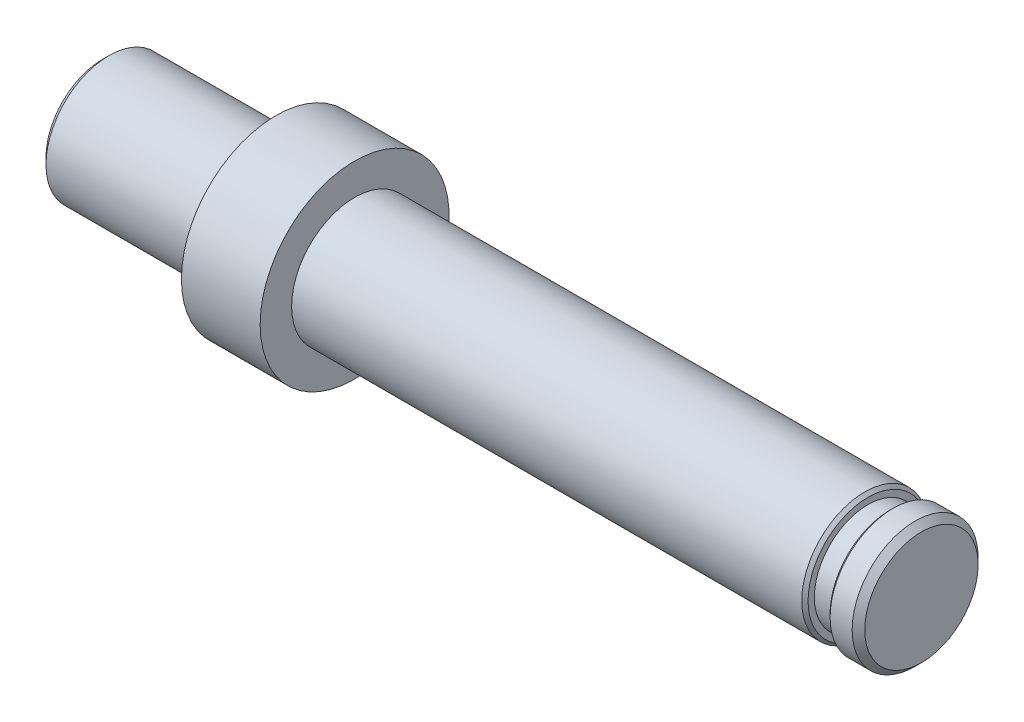
ISO-10303-21;
HEADER;
FILE_DESCRIPTION(('STEP AP214'),'2;1');
FILE_NAME('part.step','',(''),(''),'','','');
FILE_SCHEMA(('AUTOMOTIVE_DESIGN { 1 0 10303 214 1 1 1 1 }'));
ENDSEC;
DATA;
#1=APPLICATION_CONTEXT('core data for automotive mechanical design processes');
#2=APPLICATION_PROTOCOL_DEFINITION('international standard','automotive_design',2000,#1);
#3=PRODUCT_CONTEXT('',#1,'mechanical');
#4=PRODUCT('Part','Part','',(#3));
#5=PRODUCT_RELATED_PRODUCT_CATEGORY('part','',(#4));
#6=PRODUCT_DEFINITION_FORMATION('','',#4);
#7=PRODUCT_DEFINITION_CONTEXT('part definition',#1,'design');
#8=PRODUCT_DEFINITION('design','',#6,#7);
#9=PRODUCT_DEFINITION_SHAPE('','',#8);
#10=(LENGTH_UNIT() NAMED_UNIT(*) SI_UNIT(.MILLI.,.METRE.));
#11=(NAMED_UNIT(*) PLANE_ANGLE_UNIT() SI_UNIT($,.RADIAN.));
#12=(NAMED_UNIT(*) SI_UNIT($,.STERADIAN.) SOLID_ANGLE_UNIT());
#13=UNCERTAINTY_MEASURE_WITH_UNIT(LENGTH_MEASURE(1.E-05),#10,'distance_accuracy_value','');
#14=(GEOMETRIC_REPRESENTATION_CONTEXT(3) GLOBAL_UNCERTAINTY_ASSIGNED_CONTEXT((#13)) GLOBAL_UNIT_ASSIGNED_CONTEXT((#10,
#11,#12)) REPRESENTATION_CONTEXT('',''));
#15=CARTESIAN_POINT('',(0.,0.,0.));
#16=DIRECTION('',(0.,0.,1.));
#17=DIRECTION('',(1.,0.,0.));
#18=AXIS2_PLACEMENT_3D('',#15,#16,#17);
#19=CARTESIAN_POINT('',(0.,2.,0.));
#20=DIRECTION('',(1.,0.,0.));
#21=DIRECTION('',(0.,0.,-1.));
#22=AXIS2_PLACEMENT_3D('',#19,#20,#21);
#23=PLANE('',#22);
#24=CARTESIAN_POINT('',(0.,0.,0.));
#25=DIRECTION('',(1.,0.,0.));
#26=DIRECTION('',(0.,0.,-1.));
#27=AXIS2_PLACEMENT_3D('',#24,#25,#26);
#28=CIRCLE('',#27,1.8);
#29=CARTESIAN_POINT('',(0.,0.,-1.8));
#30=VERTEX_POINT('',#29);
#31=EDGE_CURVE('E76',#30,#30,#28,.F.);
#32=ORIENTED_EDGE('',*,*,#31,.T.);
#33=EDGE_LOOP('',(#32));
#34=FACE_BOUND('',#33,.T.);
#35=ADVANCED_FACE('F39',(#34),#23,.F.);
#36=CARTESIAN_POINT('',(26.,0.,0.));
#37=DIRECTION('',(-1.,0.,0.));
#38=DIRECTION('',(0.,0.,1.));
#39=AXIS2_PLACEMENT_3D('',#36,#37,#38);
#40=PLANE('',#39);
#41=CARTESIAN_POINT('',(26.,0.,0.));
#42=DIRECTION('',(-1.,0.,0.));
#43=DIRECTION('',(0.,0.,1.));
#44=AXIS2_PLACEMENT_3D('',#41,#42,#43);
#45=CIRCLE('',#44,1.8);
#46=CARTESIAN_POINT('',(26.,0.,1.8));
#47=VERTEX_POINT('',#46);
#48=EDGE_CURVE('E64',#47,#47,#45,.F.);
#49=ORIENTED_EDGE('',*,*,#48,.T.);
#50=EDGE_LOOP('',(#49));
#51=FACE_BOUND('',#50,.T.);
#52=ADVANCED_FACE('F135',(#51),#40,.F.);
#53=CARTESIAN_POINT('',(0.,0.,0.));
#54=DIRECTION('',(-1.,0.,0.));
#55=DIRECTION('',(0.,0.,1.));
#56=AXIS2_PLACEMENT_3D('',#53,#54,#55);
#57=CYLINDRICAL_SURFACE('',#56,2.);
#58=CARTESIAN_POINT('',(25.1,0.,0.));
#59=DIRECTION('',(1.,0.,0.));
#60=DIRECTION('',(0.,0.,-1.));
#61=AXIS2_PLACEMENT_3D('',#58,#59,#60);
#62=CIRCLE('',#61,2.);
#63=CARTESIAN_POINT('',(25.1,0.,-2.));
#64=VERTEX_POINT('',#63);
#65=EDGE_CURVE('E53',#64,#64,#62,.T.);
#66=ORIENTED_EDGE('',*,*,#65,.T.);
#67=EDGE_LOOP('',(#66));
#68=FACE_BOUND('',#67,.T.);
#69=CARTESIAN_POINT('',(25.8,0.,0.));
#70=DIRECTION('',(-1.,0.,0.));
#71=DIRECTION('',(0.,0.,1.));
#72=AXIS2_PLACEMENT_3D('',#69,#70,#71);
#73=CIRCLE('',#72,2.);
#74=CARTESIAN_POINT('',(25.8,0.,2.));
#75=VERTEX_POINT('',#74);
#76=EDGE_CURVE('E68',#75,#75,#73,.T.);
#77=ORIENTED_EDGE('',*,*,#76,.T.);
#78=EDGE_LOOP('',(#77));
#79=FACE_BOUND('',#78,.T.);
#80=ADVANCED_FACE('F141',(#68,#79),#57,.T.);
#81=CARTESIAN_POINT('',(25.,2.,0.));
#82=DIRECTION('',(1.,0.,0.));
#83=DIRECTION('',(0.,0.,-1.));
#84=AXIS2_PLACEMENT_3D('',#81,#82,#83);
#85=PLANE('',#84);
#86=CARTESIAN_POINT('',(25.,0.,0.));
#87=DIRECTION('',(1.,0.,0.));
#88=DIRECTION('',(0.,0.,-1.));
#89=AXIS2_PLACEMENT_3D('',#86,#87,#88);
#90=CIRCLE('',#89,1.9);
#91=CARTESIAN_POINT('',(25.,0.,-1.9));
#92=VERTEX_POINT('',#91);
#93=EDGE_CURVE('E58',#92,#92,#90,.F.);
#94=ORIENTED_EDGE('',*,*,#93,.T.);
#95=EDGE_LOOP('',(#94));
#96=FACE_BOUND('',#95,.T.);
#97=CARTESIAN_POINT('',(25.,0.,0.));
#98=DIRECTION('',(-1.,0.,0.));
#99=DIRECTION('',(0.,0.,1.));
#100=AXIS2_PLACEMENT_3D('',#97,#98,#99);
#101=CIRCLE('',#100,1.7);
#102=CARTESIAN_POINT('',(25.,0.,1.7));
#103=VERTEX_POINT('',#102);
#104=EDGE_CURVE('E80',#103,#103,#101,.T.);
#105=ORIENTED_EDGE('',*,*,#104,.F.);
#106=EDGE_LOOP('',(#105));
#107=FACE_BOUND('',#106,.T.);
#108=ADVANCED_FACE('F173',(#96,#107),#85,.F.);
#109=CARTESIAN_POINT('',(0.,0.,0.));
#110=DIRECTION('',(-1.,0.,0.));
#111=DIRECTION('',(0.,0.,1.));
#112=AXIS2_PLACEMENT_3D('',#109,#110,#111);
#113=CYLINDRICAL_SURFACE('',#112,1.7);
#114=CARTESIAN_POINT('',(24.3,0.,0.));
#115=DIRECTION('',(-1.,0.,0.));
#116=DIRECTION('',(0.,0.,1.));
#117=AXIS2_PLACEMENT_3D('',#114,#115,#116);
#118=CIRCLE('',#117,1.7);
#119=CARTESIAN_POINT('',(24.3,0.,1.7));
#120=VERTEX_POINT('',#119);
#121=EDGE_CURVE('E84',#120,#120,#118,.T.);
#122=ORIENTED_EDGE('',*,*,#121,.F.);
#123=EDGE_LOOP('',(#122));
#124=FACE_BOUND('',#123,.T.);
#125=ORIENTED_EDGE('',*,*,#104,.T.);
#126=EDGE_LOOP('',(#125));
#127=FACE_BOUND('',#126,.T.);
#128=ADVANCED_FACE('F132',(#124,#127),#113,.T.);
#129=CARTESIAN_POINT('',(24.3,1.7,0.));
#130=DIRECTION('',(-1.,0.,0.));
#131=DIRECTION('',(0.,0.,1.));
#132=AXIS2_PLACEMENT_3D('',#129,#130,#131);
#133=PLANE('',#132);
#134=CARTESIAN_POINT('',(24.3,0.,0.));
#135=DIRECTION('',(-1.,0.,0.));
#136=DIRECTION('',(0.,0.,1.));
#137=AXIS2_PLACEMENT_3D('',#134,#135,#136);
#138=CIRCLE('',#137,1.9);
#139=CARTESIAN_POINT('',(24.3,0.,1.9));
#140=VERTEX_POINT('',#139);
#141=EDGE_CURVE('E10',#140,#140,#138,.F.);
#142=ORIENTED_EDGE('',*,*,#141,.T.);
#143=EDGE_LOOP('',(#142));
#144=FACE_BOUND('',#143,.T.);
#145=ORIENTED_EDGE('',*,*,#121,.T.);
#146=EDGE_LOOP('',(#145));
#147=FACE_BOUND('',#146,.T.);
#148=ADVANCED_FACE('F127',(#144,#147),#133,.F.);
#149=CARTESIAN_POINT('',(0.,0.,0.));
#150=DIRECTION('',(-1.,0.,0.));
#151=DIRECTION('',(0.,0.,1.));
#152=AXIS2_PLACEMENT_3D('',#149,#150,#151);
#153=CYLINDRICAL_SURFACE('',#152,2.);
#154=CARTESIAN_POINT('',(24.2,0.,0.));
#155=DIRECTION('',(-1.,0.,0.));
#156=DIRECTION('',(0.,0.,1.));
#157=AXIS2_PLACEMENT_3D('',#154,#155,#156);
#158=CIRCLE('',#157,2.);
#159=CARTESIAN_POINT('',(24.2,0.,2.));
#160=VERTEX_POINT('',#159);
#161=EDGE_CURVE('E48',#160,#160,#158,.T.);
#162=ORIENTED_EDGE('',*,*,#161,.T.);
#163=EDGE_LOOP('',(#162));
#164=FACE_BOUND('',#163,.T.);
#165=CARTESIAN_POINT('',(8.,0.,0.));
#166=DIRECTION('',(-1.,0.,0.));
#167=DIRECTION('',(0.,0.,1.));
#168=AXIS2_PLACEMENT_3D('',#165,#166,#167);
#169=CIRCLE('',#168,2.);
#170=CARTESIAN_POINT('',(8.,0.,2.));
#171=VERTEX_POINT('',#170);
#172=EDGE_CURVE('E88',#171,#171,#169,.T.);
#173=ORIENTED_EDGE('',*,*,#172,.F.);
#174=EDGE_LOOP('',(#173));
#175=FACE_BOUND('',#174,.T.);
#176=ADVANCED_FACE('F122',(#164,#175),#153,.T.);
#177=CARTESIAN_POINT('',(8.,2.,0.));
#178=DIRECTION('',(-1.,0.,0.));
#179=DIRECTION('',(0.,0.,1.));
#180=AXIS2_PLACEMENT_3D('',#177,#178,#179);
#181=PLANE('',#180);
#182=CARTESIAN_POINT('',(8.,0.,0.));
#183=DIRECTION('',(-1.,0.,0.));
#184=DIRECTION('',(0.,0.,1.));
#185=AXIS2_PLACEMENT_3D('',#182,#183,#184);
#186=CIRCLE('',#185,3.);
#187=CARTESIAN_POINT('',(8.,0.,3.));
#188=VERTEX_POINT('',#187);
#189=EDGE_CURVE('E92',#188,#188,#186,.T.);
#190=ORIENTED_EDGE('',*,*,#189,.F.);
#191=EDGE_LOOP('',(#190));
#192=FACE_BOUND('',#191,.T.);
#193=ORIENTED_EDGE('',*,*,#172,.T.);
#194=EDGE_LOOP('',(#193));
#195=FACE_BOUND('',#194,.T.);
#196=ADVANCED_FACE('F116',(#192,#195),#181,.F.);
#197=CARTESIAN_POINT('',(0.,0.,0.));
#198=DIRECTION('',(-1.,0.,0.));
#199=DIRECTION('',(0.,0.,1.));
#200=AXIS2_PLACEMENT_3D('',#197,#198,#199);
#201=CYLINDRICAL_SURFACE('',#200,3.);
#202=CARTESIAN_POINT('',(5.5,0.,0.));
#203=DIRECTION('',(-1.,0.,0.));
#204=DIRECTION('',(0.,0.,1.));
#205=AXIS2_PLACEMENT_3D('',#202,#203,#204);
#206=CIRCLE('',#205,3.);
#207=CARTESIAN_POINT('',(5.5,0.,3.));
#208=VERTEX_POINT('',#207);
#209=EDGE_CURVE('E96',#208,#208,#206,.T.);
#210=ORIENTED_EDGE('',*,*,#209,.F.);
#211=EDGE_LOOP('',(#210));
#212=FACE_BOUND('',#211,.T.);
#213=ORIENTED_EDGE('',*,*,#189,.T.);
#214=EDGE_LOOP('',(#213));
#215=FACE_BOUND('',#214,.T.);
#216=ADVANCED_FACE('F110',(#212,#215),#201,.T.);
#217=CARTESIAN_POINT('',(5.5,3.,0.));
#218=DIRECTION('',(1.,0.,0.));
#219=DIRECTION('',(0.,0.,-1.));
#220=AXIS2_PLACEMENT_3D('',#217,#218,#219);
#221=PLANE('',#220);
#222=CARTESIAN_POINT('',(5.5,0.,0.));
#223=DIRECTION('',(-1.,0.,0.));
#224=DIRECTION('',(0.,0.,1.));
#225=AXIS2_PLACEMENT_3D('',#222,#223,#224);
#226=CIRCLE('',#225,2.);
#227=CARTESIAN_POINT('',(5.5,0.,2.));
#228=VERTEX_POINT('',#227);
#229=EDGE_CURVE('E100',#228,#228,#226,.T.);
#230=ORIENTED_EDGE('',*,*,#229,.F.);
#231=EDGE_LOOP('',(#230));
#232=FACE_BOUND('',#231,.T.);
#233=ORIENTED_EDGE('',*,*,#209,.T.);
#234=EDGE_LOOP('',(#233));
#235=FACE_BOUND('',#234,.T.);
#236=ADVANCED_FACE('F107',(#232,#235),#221,.F.);
#237=CARTESIAN_POINT('',(0.,0.,0.));
#238=DIRECTION('',(-1.,0.,0.));
#239=DIRECTION('',(0.,0.,1.));
#240=AXIS2_PLACEMENT_3D('',#237,#238,#239);
#241=CYLINDRICAL_SURFACE('',#240,2.);
#242=CARTESIAN_POINT('',(0.200000000000001,0.,0.));
#243=DIRECTION('',(1.,0.,0.));
#244=DIRECTION('',(0.,0.,-1.));
#245=AXIS2_PLACEMENT_3D('',#242,#243,#244);
#246=CIRCLE('',#245,2.);
#247=CARTESIAN_POINT('',(0.200000000000001,0.,-2.));
#248=VERTEX_POINT('',#247);
#249=EDGE_CURVE('E72',#248,#248,#246,.T.);
#250=ORIENTED_EDGE('',*,*,#249,.T.);
#251=EDGE_LOOP('',(#250));
#252=FACE_BOUND('',#251,.T.);
#253=ORIENTED_EDGE('',*,*,#229,.T.);
#254=EDGE_LOOP('',(#253));
#255=FACE_BOUND('',#254,.T.);
#256=ADVANCED_FACE('F105',(#252,#255),#241,.T.);
#257=CARTESIAN_POINT('',(0.,0.,0.));
#258=DIRECTION('',(1.,0.,0.));
#259=DIRECTION('',(0.,0.,-1.));
#260=AXIS2_PLACEMENT_3D('',#257,#258,#259);
#261=CONICAL_SURFACE('',#260,1.8,0.785398163397448);
#262=ORIENTED_EDGE('',*,*,#249,.F.);
#263=EDGE_LOOP('',(#262));
#264=FACE_BOUND('',#263,.T.);
#265=ORIENTED_EDGE('',*,*,#31,.F.);
#266=EDGE_LOOP('',(#265));
#267=FACE_BOUND('',#266,.T.);
#268=ADVANCED_FACE('F147',(#264,#267),#261,.T.);
#269=CARTESIAN_POINT('',(25.8,0.,0.));
#270=DIRECTION('',(-1.,0.,0.));
#271=DIRECTION('',(0.,0.,1.));
#272=AXIS2_PLACEMENT_3D('',#269,#270,#271);
#273=CONICAL_SURFACE('',#272,2.,0.785398163397444);
#274=ORIENTED_EDGE('',*,*,#48,.F.);
#275=EDGE_LOOP('',(#274));
#276=FACE_BOUND('',#275,.T.);
#277=ORIENTED_EDGE('',*,*,#76,.F.);
#278=EDGE_LOOP('',(#277));
#279=FACE_BOUND('',#278,.T.);
#280=ADVANCED_FACE('F153',(#276,#279),#273,.T.);
#281=CARTESIAN_POINT('',(25.,0.,0.));
#282=DIRECTION('',(1.,0.,0.));
#283=DIRECTION('',(0.,0.,-1.));
#284=AXIS2_PLACEMENT_3D('',#281,#282,#283);
#285=CONICAL_SURFACE('',#284,1.9,0.78539816339744);
#286=ORIENTED_EDGE('',*,*,#65,.F.);
#287=EDGE_LOOP('',(#286));
#288=FACE_BOUND('',#287,.T.);
#289=ORIENTED_EDGE('',*,*,#93,.F.);
#290=EDGE_LOOP('',(#289));
#291=FACE_BOUND('',#290,.T.);
#292=ADVANCED_FACE('F159',(#288,#291),#285,.T.);
#293=CARTESIAN_POINT('',(24.2,0.,0.));
#294=DIRECTION('',(-1.,0.,0.));
#295=DIRECTION('',(0.,0.,1.));
#296=AXIS2_PLACEMENT_3D('',#293,#294,#295);
#297=CONICAL_SURFACE('',#296,2.,0.785398163397461);
#298=ORIENTED_EDGE('',*,*,#141,.F.);
#299=EDGE_LOOP('',(#298));
#300=FACE_BOUND('',#299,.T.);
#301=ORIENTED_EDGE('',*,*,#161,.F.);
#302=EDGE_LOOP('',(#301));
#303=FACE_BOUND('',#302,.T.);
#304=ADVANCED_FACE('F42',(#300,#303),#297,.T.);
#305=CLOSED_SHELL('',(#35,#52,#80,#108,#128,#148,#176,#196,#216,#236,#256,#268,#280,#292,#304));
#306=MANIFOLD_SOLID_BREP('B2',#305);
#307=ADVANCED_BREP_SHAPE_REPRESENTATION('',(#18,#306),#14);
#308=SHAPE_DEFINITION_REPRESENTATION(#9,#307);
ENDSEC;
END-ISO-10303-21;
